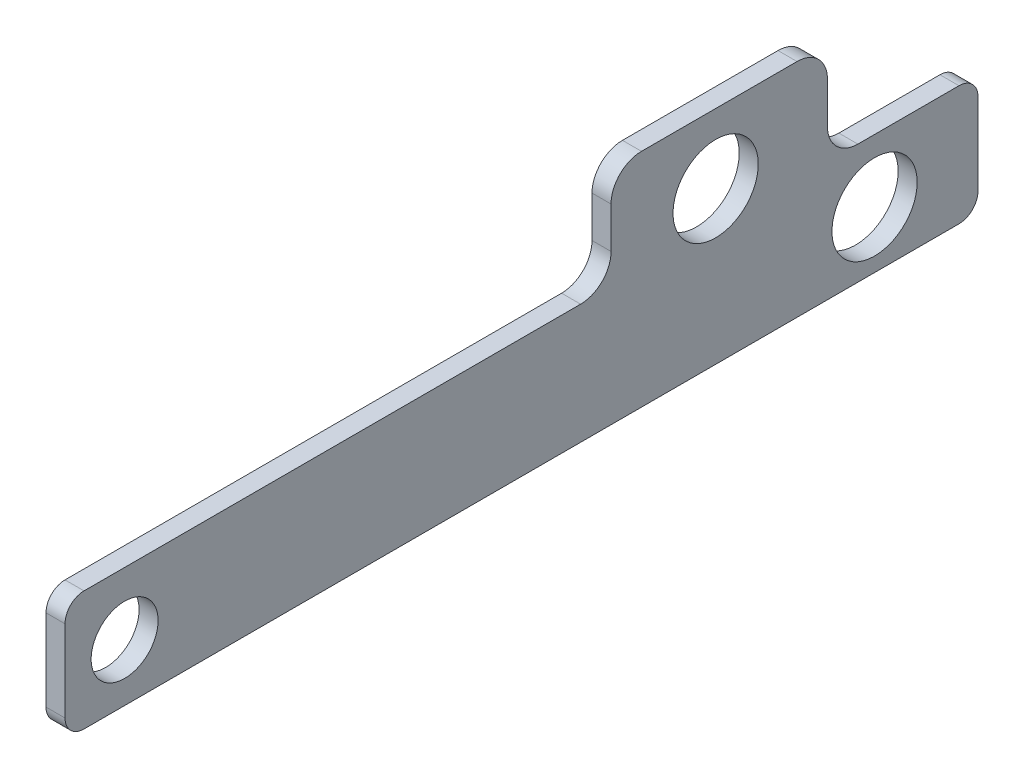
ISO-10303-21;
HEADER;
FILE_DESCRIPTION(('STEP AP214'),'2;1');
FILE_NAME('part.step','',(''),(''),'','','');
FILE_SCHEMA(('AUTOMOTIVE_DESIGN { 1 0 10303 214 1 1 1 1 }'));
ENDSEC;
DATA;
#1=APPLICATION_CONTEXT('core data for automotive mechanical design processes');
#2=APPLICATION_PROTOCOL_DEFINITION('international standard','automotive_design',2000,#1);
#3=PRODUCT_CONTEXT('',#1,'mechanical');
#4=PRODUCT('Part','Part','',(#3));
#5=PRODUCT_RELATED_PRODUCT_CATEGORY('part','',(#4));
#6=PRODUCT_DEFINITION_FORMATION('','',#4);
#7=PRODUCT_DEFINITION_CONTEXT('part definition',#1,'design');
#8=PRODUCT_DEFINITION('design','',#6,#7);
#9=PRODUCT_DEFINITION_SHAPE('','',#8);
#10=(LENGTH_UNIT() NAMED_UNIT(*) SI_UNIT(.MILLI.,.METRE.));
#11=(NAMED_UNIT(*) PLANE_ANGLE_UNIT() SI_UNIT($,.RADIAN.));
#12=(NAMED_UNIT(*) SI_UNIT($,.STERADIAN.) SOLID_ANGLE_UNIT());
#13=UNCERTAINTY_MEASURE_WITH_UNIT(LENGTH_MEASURE(1.E-05),#10,'distance_accuracy_value','');
#14=(GEOMETRIC_REPRESENTATION_CONTEXT(3) GLOBAL_UNCERTAINTY_ASSIGNED_CONTEXT((#13)) GLOBAL_UNIT_ASSIGNED_CONTEXT((#10,
#11,#12)) REPRESENTATION_CONTEXT('',''));
#15=CARTESIAN_POINT('',(0.,0.,0.));
#16=DIRECTION('',(0.,0.,1.));
#17=DIRECTION('',(1.,0.,0.));
#18=AXIS2_PLACEMENT_3D('',#15,#16,#17);
#19=CARTESIAN_POINT('',(6.35,23.1734812702163,0.));
#20=DIRECTION('',(0.,1.,0.));
#21=DIRECTION('',(0.,0.,1.));
#22=AXIS2_PLACEMENT_3D('',#19,#20,#21);
#23=PLANE('',#22);
#24=DIRECTION('',(0.,0.,-1.));
#25=VECTOR('',#24,1.);
#26=CARTESIAN_POINT('',(0.,23.1734812702163,0.));
#27=LINE('',#26,#25);
#28=CARTESIAN_POINT('',(0.,23.1734812702163,-192.451413184352));
#29=VERTEX_POINT('',#28);
#30=CARTESIAN_POINT('',(0.,23.1734812702163,-244.379560249725));
#31=VERTEX_POINT('',#30);
#32=EDGE_CURVE('E317',#29,#31,#27,.T.);
#33=ORIENTED_EDGE('',*,*,#32,.F.);
#34=DIRECTION('',(-1.,0.,0.));
#35=VECTOR('',#34,1.);
#36=CARTESIAN_POINT('',(6.35,23.1734812702163,-192.451413184352));
#37=LINE('',#36,#35);
#38=CARTESIAN_POINT('',(6.35,23.1734812702163,-192.451413184352));
#39=VERTEX_POINT('',#38);
#40=EDGE_CURVE('E256',#29,#39,#37,.F.);
#41=ORIENTED_EDGE('',*,*,#40,.T.);
#42=DIRECTION('',(0.,0.,-1.));
#43=VECTOR('',#42,1.);
#44=CARTESIAN_POINT('',(6.35,23.1734812702163,0.));
#45=LINE('',#44,#43);
#46=CARTESIAN_POINT('',(6.35,23.1734812702163,-244.379560249725));
#47=VERTEX_POINT('',#46);
#48=EDGE_CURVE('E347',#39,#47,#45,.T.);
#49=ORIENTED_EDGE('',*,*,#48,.T.);
#50=DIRECTION('',(-1.,0.,0.));
#51=VECTOR('',#50,1.);
#52=CARTESIAN_POINT('',(0.,23.1734812702163,-244.379560249725));
#53=LINE('',#52,#51);
#54=EDGE_CURVE('E252',#47,#31,#53,.T.);
#55=ORIENTED_EDGE('',*,*,#54,.T.);
#56=EDGE_LOOP('',(#33,#41,#49,#55));
#57=FACE_BOUND('',#56,.T.);
#58=ADVANCED_FACE('F41',(#57),#23,.T.);
#59=CARTESIAN_POINT('',(6.35,0.,-182.291413184352));
#60=DIRECTION('',(0.,0.,1.));
#61=DIRECTION('',(1.,0.,0.));
#62=AXIS2_PLACEMENT_3D('',#59,#60,#61);
#63=PLANE('',#62);
#64=DIRECTION('',(0.,1.,0.));
#65=VECTOR('',#64,1.);
#66=CARTESIAN_POINT('',(6.35,0.,-182.291413184352));
#67=LINE('',#66,#65);
#68=CARTESIAN_POINT('',(6.35,-0.698938763049273,-182.291413184352));
#69=VERTEX_POINT('',#68);
#70=CARTESIAN_POINT('',(6.35,13.0134812702163,-182.291413184352));
#71=VERTEX_POINT('',#70);
#72=EDGE_CURVE('E353',#69,#71,#67,.T.);
#73=ORIENTED_EDGE('',*,*,#72,.T.);
#74=DIRECTION('',(-1.,0.,0.));
#75=VECTOR('',#74,1.);
#76=CARTESIAN_POINT('',(6.35,13.0134812702163,-182.291413184352));
#77=LINE('',#76,#75);
#78=CARTESIAN_POINT('',(0.,13.0134812702163,-182.291413184352));
#79=VERTEX_POINT('',#78);
#80=EDGE_CURVE('E242',#71,#79,#77,.T.);
#81=ORIENTED_EDGE('',*,*,#80,.T.);
#82=DIRECTION('',(0.,1.,0.));
#83=VECTOR('',#82,1.);
#84=CARTESIAN_POINT('',(0.,0.,-182.291413184352));
#85=LINE('',#84,#83);
#86=CARTESIAN_POINT('',(0.,-0.698938763049273,-182.291413184352));
#87=VERTEX_POINT('',#86);
#88=EDGE_CURVE('E321',#87,#79,#85,.T.);
#89=ORIENTED_EDGE('',*,*,#88,.F.);
#90=DIRECTION('',(-1.,0.,0.));
#91=VECTOR('',#90,1.);
#92=CARTESIAN_POINT('',(6.35,-0.698938763049273,-182.291413184352));
#93=LINE('',#92,#91);
#94=EDGE_CURVE('E239',#87,#69,#93,.F.);
#95=ORIENTED_EDGE('',*,*,#94,.T.);
#96=EDGE_LOOP('',(#73,#81,#89,#95));
#97=FACE_BOUND('',#96,.T.);
#98=ADVANCED_FACE('F401',(#97),#63,.T.);
#99=CARTESIAN_POINT('',(6.35,-10.8589387630493,0.));
#100=DIRECTION('',(0.,1.,0.));
#101=DIRECTION('',(0.,0.,1.));
#102=AXIS2_PLACEMENT_3D('',#99,#100,#101);
#103=PLANE('',#102);
#104=DIRECTION('',(0.,0.,-1.));
#105=VECTOR('',#104,1.);
#106=CARTESIAN_POINT('',(6.35,-10.8589387630493,0.));
#107=LINE('',#106,#105);
#108=CARTESIAN_POINT('',(6.35,-10.8589387630493,-6.35));
#109=VERTEX_POINT('',#108);
#110=CARTESIAN_POINT('',(6.35,-10.8589387630493,-172.131413184352));
#111=VERTEX_POINT('',#110);
#112=EDGE_CURVE('E359',#109,#111,#107,.T.);
#113=ORIENTED_EDGE('',*,*,#112,.T.);
#114=DIRECTION('',(-1.,0.,0.));
#115=VECTOR('',#114,1.);
#116=CARTESIAN_POINT('',(0.,-10.8589387630493,-172.131413184352));
#117=LINE('',#116,#115);
#118=CARTESIAN_POINT('',(0.,-10.8589387630493,-172.131413184352));
#119=VERTEX_POINT('',#118);
#120=EDGE_CURVE('E265',#111,#119,#117,.T.);
#121=ORIENTED_EDGE('',*,*,#120,.T.);
#122=DIRECTION('',(0.,0.,-1.));
#123=VECTOR('',#122,1.);
#124=CARTESIAN_POINT('',(0.,-10.8589387630493,0.));
#125=LINE('',#124,#123);
#126=CARTESIAN_POINT('',(0.,-10.8589387630493,-6.35));
#127=VERTEX_POINT('',#126);
#128=EDGE_CURVE('E324',#127,#119,#125,.T.);
#129=ORIENTED_EDGE('',*,*,#128,.F.);
#130=DIRECTION('',(-1.,0.,0.));
#131=VECTOR('',#130,1.);
#132=CARTESIAN_POINT('',(6.35,-10.8589387630493,-6.35));
#133=LINE('',#132,#131);
#134=EDGE_CURVE('E236',#127,#109,#133,.F.);
#135=ORIENTED_EDGE('',*,*,#134,.T.);
#136=EDGE_LOOP('',(#113,#121,#129,#135));
#137=FACE_BOUND('',#136,.T.);
#138=ADVANCED_FACE('F394',(#137),#103,.T.);
#139=CARTESIAN_POINT('',(6.35,0.,0.));
#140=DIRECTION('',(0.,0.,-1.));
#141=DIRECTION('',(0.,1.,0.));
#142=AXIS2_PLACEMENT_3D('',#139,#140,#141);
#143=PLANE('',#142);
#144=DIRECTION('',(0.,-1.,0.));
#145=VECTOR('',#144,1.);
#146=CARTESIAN_POINT('',(0.,0.,0.));
#147=LINE('',#146,#145);
#148=CARTESIAN_POINT('',(0.,-17.2089387630493,0.));
#149=VERTEX_POINT('',#148);
#150=CARTESIAN_POINT('',(0.,-44.45,0.));
#151=VERTEX_POINT('',#150);
#152=EDGE_CURVE('E328',#149,#151,#147,.T.);
#153=ORIENTED_EDGE('',*,*,#152,.T.);
#154=DIRECTION('',(-1.,0.,0.));
#155=VECTOR('',#154,1.);
#156=CARTESIAN_POINT('',(6.35,-44.45,0.));
#157=LINE('',#156,#155);
#158=CARTESIAN_POINT('',(6.35,-44.45,0.));
#159=VERTEX_POINT('',#158);
#160=EDGE_CURVE('E233',#151,#159,#157,.F.);
#161=ORIENTED_EDGE('',*,*,#160,.T.);
#162=DIRECTION('',(0.,-1.,0.));
#163=VECTOR('',#162,1.);
#164=CARTESIAN_POINT('',(6.35,0.,0.));
#165=LINE('',#164,#163);
#166=CARTESIAN_POINT('',(6.35,-17.2089387630493,0.));
#167=VERTEX_POINT('',#166);
#168=EDGE_CURVE('E362',#167,#159,#165,.T.);
#169=ORIENTED_EDGE('',*,*,#168,.F.);
#170=DIRECTION('',(-1.,0.,0.));
#171=VECTOR('',#170,1.);
#172=CARTESIAN_POINT('',(0.,-17.2089387630493,0.));
#173=LINE('',#172,#171);
#174=EDGE_CURVE('E229',#167,#149,#173,.T.);
#175=ORIENTED_EDGE('',*,*,#174,.T.);
#176=EDGE_LOOP('',(#153,#161,#169,#175));
#177=FACE_BOUND('',#176,.T.);
#178=ADVANCED_FACE('F385',(#177),#143,.F.);
#179=CARTESIAN_POINT('',(6.35,-50.8,0.));
#180=DIRECTION('',(0.,1.,0.));
#181=DIRECTION('',(0.,0.,1.));
#182=AXIS2_PLACEMENT_3D('',#179,#180,#181);
#183=PLANE('',#182);
#184=DIRECTION('',(0.,0.,-1.));
#185=VECTOR('',#184,1.);
#186=CARTESIAN_POINT('',(0.,-50.8,0.));
#187=LINE('',#186,#185);
#188=CARTESIAN_POINT('',(0.,-50.8,-6.35));
#189=VERTEX_POINT('',#188);
#190=CARTESIAN_POINT('',(0.,-50.8,-298.45));
#191=VERTEX_POINT('',#190);
#192=EDGE_CURVE('E183',#189,#191,#187,.T.);
#193=ORIENTED_EDGE('',*,*,#192,.T.);
#194=DIRECTION('',(-1.,0.,0.));
#195=VECTOR('',#194,1.);
#196=CARTESIAN_POINT('',(6.35,-50.8,-298.45));
#197=LINE('',#196,#195);
#198=CARTESIAN_POINT('',(6.35,-50.8,-298.45));
#199=VERTEX_POINT('',#198);
#200=EDGE_CURVE('E212',#191,#199,#197,.F.);
#201=ORIENTED_EDGE('',*,*,#200,.T.);
#202=DIRECTION('',(0.,0.,-1.));
#203=VECTOR('',#202,1.);
#204=CARTESIAN_POINT('',(6.35,-50.8,0.));
#205=LINE('',#204,#203);
#206=CARTESIAN_POINT('',(6.35,-50.8,-6.35));
#207=VERTEX_POINT('',#206);
#208=EDGE_CURVE('E366',#207,#199,#205,.T.);
#209=ORIENTED_EDGE('',*,*,#208,.F.);
#210=DIRECTION('',(-1.,0.,0.));
#211=VECTOR('',#210,1.);
#212=CARTESIAN_POINT('',(6.35,-50.8,-6.35));
#213=LINE('',#212,#211);
#214=EDGE_CURVE('E208',#207,#189,#213,.T.);
#215=ORIENTED_EDGE('',*,*,#214,.T.);
#216=EDGE_LOOP('',(#193,#201,#209,#215));
#217=FACE_BOUND('',#216,.T.);
#218=ADVANCED_FACE('F376',(#217),#183,.F.);
#219=CARTESIAN_POINT('',(6.35,0.,-304.8));
#220=DIRECTION('',(0.,0.,-1.));
#221=DIRECTION('',(-1.,0.,0.));
#222=AXIS2_PLACEMENT_3D('',#219,#220,#221);
#223=PLANE('',#222);
#224=DIRECTION('',(0.,-1.,0.));
#225=VECTOR('',#224,1.);
#226=CARTESIAN_POINT('',(6.35,0.,-304.8));
#227=LINE('',#226,#225);
#228=CARTESIAN_POINT('',(6.35,-17.2089387630493,-304.8));
#229=VERTEX_POINT('',#228);
#230=CARTESIAN_POINT('',(6.35,-44.45,-304.8));
#231=VERTEX_POINT('',#230);
#232=EDGE_CURVE('E309',#229,#231,#227,.T.);
#233=ORIENTED_EDGE('',*,*,#232,.T.);
#234=DIRECTION('',(-1.,0.,0.));
#235=VECTOR('',#234,1.);
#236=CARTESIAN_POINT('',(0.,-44.45,-304.8));
#237=LINE('',#236,#235);
#238=CARTESIAN_POINT('',(0.,-44.45,-304.8));
#239=VERTEX_POINT('',#238);
#240=EDGE_CURVE('E181',#231,#239,#237,.T.);
#241=ORIENTED_EDGE('',*,*,#240,.T.);
#242=DIRECTION('',(0.,-1.,0.));
#243=VECTOR('',#242,1.);
#244=CARTESIAN_POINT('',(0.,0.,-304.8));
#245=LINE('',#244,#243);
#246=CARTESIAN_POINT('',(0.,-17.2089387630493,-304.8));
#247=VERTEX_POINT('',#246);
#248=EDGE_CURVE('E163',#247,#239,#245,.T.);
#249=ORIENTED_EDGE('',*,*,#248,.F.);
#250=DIRECTION('',(-1.,0.,0.));
#251=VECTOR('',#250,1.);
#252=CARTESIAN_POINT('',(6.35,-17.2089387630493,-304.8));
#253=LINE('',#252,#251);
#254=EDGE_CURVE('E178',#247,#229,#253,.F.);
#255=ORIENTED_EDGE('',*,*,#254,.T.);
#256=EDGE_LOOP('',(#233,#241,#249,#255));
#257=FACE_BOUND('',#256,.T.);
#258=ADVANCED_FACE('F177',(#257),#223,.T.);
#259=CARTESIAN_POINT('',(6.35,-10.8589387630493,0.));
#260=DIRECTION('',(0.,-1.,0.));
#261=DIRECTION('',(0.,0.,-1.));
#262=AXIS2_PLACEMENT_3D('',#259,#260,#261);
#263=PLANE('',#262);
#264=DIRECTION('',(0.,0.,1.));
#265=VECTOR('',#264,1.);
#266=CARTESIAN_POINT('',(0.,-10.8589387630493,0.));
#267=LINE('',#266,#265);
#268=CARTESIAN_POINT('',(0.,-10.8589387630493,-298.45));
#269=VERTEX_POINT('',#268);
#270=CARTESIAN_POINT('',(0.,-10.8589387630493,-264.699560249725));
#271=VERTEX_POINT('',#270);
#272=EDGE_CURVE('E165',#269,#271,#267,.T.);
#273=ORIENTED_EDGE('',*,*,#272,.T.);
#274=DIRECTION('',(-1.,0.,0.));
#275=VECTOR('',#274,1.);
#276=CARTESIAN_POINT('',(6.35,-10.8589387630493,-264.699560249725));
#277=LINE('',#276,#275);
#278=CARTESIAN_POINT('',(6.35,-10.8589387630493,-264.699560249725));
#279=VERTEX_POINT('',#278);
#280=EDGE_CURVE('E275',#271,#279,#277,.F.);
#281=ORIENTED_EDGE('',*,*,#280,.T.);
#282=DIRECTION('',(0.,0.,1.));
#283=VECTOR('',#282,1.);
#284=CARTESIAN_POINT('',(6.35,-10.8589387630493,0.));
#285=LINE('',#284,#283);
#286=CARTESIAN_POINT('',(6.35,-10.8589387630493,-298.45));
#287=VERTEX_POINT('',#286);
#288=EDGE_CURVE('E301',#287,#279,#285,.T.);
#289=ORIENTED_EDGE('',*,*,#288,.F.);
#290=DIRECTION('',(-1.,0.,0.));
#291=VECTOR('',#290,1.);
#292=CARTESIAN_POINT('',(0.,-10.8589387630493,-298.45));
#293=LINE('',#292,#291);
#294=EDGE_CURVE('E226',#287,#269,#293,.T.);
#295=ORIENTED_EDGE('',*,*,#294,.T.);
#296=EDGE_LOOP('',(#273,#281,#289,#295));
#297=FACE_BOUND('',#296,.T.);
#298=ADVANCED_FACE('F289',(#297),#263,.F.);
#299=CARTESIAN_POINT('',(6.35,-31.79237268089,-270.266345373855));
#300=DIRECTION('',(-1.,0.,0.));
#301=DIRECTION('',(0.,0.,1.));
#302=AXIS2_PLACEMENT_3D('',#299,#300,#301);
#303=CYLINDRICAL_SURFACE('',#302,14.224);
#304=CARTESIAN_POINT('',(6.35,-31.79237268089,-270.266345373855));
#305=DIRECTION('',(1.,0.,0.));
#306=DIRECTION('',(0.,0.,-1.));
#307=AXIS2_PLACEMENT_3D('',#304,#305,#306);
#308=CIRCLE('',#307,14.224);
#309=CARTESIAN_POINT('',(6.35,-31.79237268089,-284.490345373855));
#310=VERTEX_POINT('',#309);
#311=EDGE_CURVE('E196',#310,#310,#308,.T.);
#312=ORIENTED_EDGE('',*,*,#311,.T.);
#313=EDGE_LOOP('',(#312));
#314=FACE_BOUND('',#313,.T.);
#315=CARTESIAN_POINT('',(0.,-31.79237268089,-270.266345373855));
#316=DIRECTION('',(1.,0.,0.));
#317=DIRECTION('',(0.,0.,-1.));
#318=AXIS2_PLACEMENT_3D('',#315,#316,#317);
#319=CIRCLE('',#318,14.224);
#320=CARTESIAN_POINT('',(0.,-31.79237268089,-284.490345373855));
#321=VERTEX_POINT('',#320);
#322=EDGE_CURVE('E336',#321,#321,#319,.T.);
#323=ORIENTED_EDGE('',*,*,#322,.F.);
#324=EDGE_LOOP('',(#323));
#325=FACE_BOUND('',#324,.T.);
#326=ADVANCED_FACE('F509',(#314,#325),#303,.F.);
#327=CARTESIAN_POINT('',(6.35,0.,-254.539560249725));
#328=DIRECTION('',(0.,0.,1.));
#329=DIRECTION('',(1.,0.,0.));
#330=AXIS2_PLACEMENT_3D('',#327,#328,#329);
#331=PLANE('',#330);
#332=DIRECTION('',(0.,1.,0.));
#333=VECTOR('',#332,1.);
#334=CARTESIAN_POINT('',(6.35,0.,-254.539560249725));
#335=LINE('',#334,#333);
#336=CARTESIAN_POINT('',(6.35,-0.698938763049273,-254.539560249725));
#337=VERTEX_POINT('',#336);
#338=CARTESIAN_POINT('',(6.35,13.0134812702163,-254.539560249725));
#339=VERTEX_POINT('',#338);
#340=EDGE_CURVE('E299',#337,#339,#335,.T.);
#341=ORIENTED_EDGE('',*,*,#340,.F.);
#342=DIRECTION('',(-1.,0.,0.));
#343=VECTOR('',#342,1.);
#344=CARTESIAN_POINT('',(0.,-0.698938763049273,-254.539560249725));
#345=LINE('',#344,#343);
#346=CARTESIAN_POINT('',(0.,-0.698938763049273,-254.539560249725));
#347=VERTEX_POINT('',#346);
#348=EDGE_CURVE('E271',#337,#347,#345,.T.);
#349=ORIENTED_EDGE('',*,*,#348,.T.);
#350=DIRECTION('',(0.,1.,0.));
#351=VECTOR('',#350,1.);
#352=CARTESIAN_POINT('',(0.,0.,-254.539560249725));
#353=LINE('',#352,#351);
#354=CARTESIAN_POINT('',(0.,13.0134812702163,-254.539560249725));
#355=VERTEX_POINT('',#354);
#356=EDGE_CURVE('E284',#347,#355,#353,.T.);
#357=ORIENTED_EDGE('',*,*,#356,.T.);
#358=DIRECTION('',(-1.,0.,0.));
#359=VECTOR('',#358,1.);
#360=CARTESIAN_POINT('',(6.35,13.0134812702163,-254.539560249725));
#361=LINE('',#360,#359);
#362=EDGE_CURVE('E65',#355,#339,#361,.F.);
#363=ORIENTED_EDGE('',*,*,#362,.T.);
#364=EDGE_LOOP('',(#341,#349,#357,#363));
#365=FACE_BOUND('',#364,.T.);
#366=ADVANCED_FACE('F302',(#365),#331,.F.);
#367=CARTESIAN_POINT('',(6.35,0.,-217.210700397704));
#368=DIRECTION('',(-1.,0.,0.));
#369=DIRECTION('',(0.,0.,1.));
#370=AXIS2_PLACEMENT_3D('',#367,#368,#369);
#371=CYLINDRICAL_SURFACE('',#370,14.224);
#372=CARTESIAN_POINT('',(6.35,0.,-217.210700397704));
#373=DIRECTION('',(1.,0.,0.));
#374=DIRECTION('',(0.,0.,-1.));
#375=AXIS2_PLACEMENT_3D('',#372,#373,#374);
#376=CIRCLE('',#375,14.224);
#377=CARTESIAN_POINT('',(6.35,0.,-231.434700397704));
#378=VERTEX_POINT('',#377);
#379=EDGE_CURVE('E342',#378,#378,#376,.T.);
#380=ORIENTED_EDGE('',*,*,#379,.T.);
#381=EDGE_LOOP('',(#380));
#382=FACE_BOUND('',#381,.T.);
#383=CARTESIAN_POINT('',(0.,0.,-217.210700397704));
#384=DIRECTION('',(1.,0.,0.));
#385=DIRECTION('',(0.,0.,-1.));
#386=AXIS2_PLACEMENT_3D('',#383,#384,#385);
#387=CIRCLE('',#386,14.224);
#388=CARTESIAN_POINT('',(0.,0.,-231.434700397704));
#389=VERTEX_POINT('',#388);
#390=EDGE_CURVE('E313',#389,#389,#387,.T.);
#391=ORIENTED_EDGE('',*,*,#390,.F.);
#392=EDGE_LOOP('',(#391));
#393=FACE_BOUND('',#392,.T.);
#394=ADVANCED_FACE('F423',(#382,#393),#371,.F.);
#395=CARTESIAN_POINT('',(6.35,-31.79237268089,-19.8958454166487));
#396=DIRECTION('',(-1.,0.,0.));
#397=DIRECTION('',(0.,0.,1.));
#398=AXIS2_PLACEMENT_3D('',#395,#396,#397);
#399=CYLINDRICAL_SURFACE('',#398,11.176);
#400=CARTESIAN_POINT('',(6.35,-31.79237268089,-19.8958454166487));
#401=DIRECTION('',(1.,0.,0.));
#402=DIRECTION('',(0.,0.,-1.));
#403=AXIS2_PLACEMENT_3D('',#400,#401,#402);
#404=CIRCLE('',#403,11.176);
#405=CARTESIAN_POINT('',(6.35,-31.79237268089,-31.0718454166487));
#406=VERTEX_POINT('',#405);
#407=EDGE_CURVE('E189',#406,#406,#404,.T.);
#408=ORIENTED_EDGE('',*,*,#407,.T.);
#409=EDGE_LOOP('',(#408));
#410=FACE_BOUND('',#409,.T.);
#411=CARTESIAN_POINT('',(0.,-31.79237268089,-19.8958454166487));
#412=DIRECTION('',(1.,0.,0.));
#413=DIRECTION('',(0.,0.,-1.));
#414=AXIS2_PLACEMENT_3D('',#411,#412,#413);
#415=CIRCLE('',#414,11.176);
#416=CARTESIAN_POINT('',(0.,-31.79237268089,-31.0718454166487));
#417=VERTEX_POINT('',#416);
#418=EDGE_CURVE('E199',#417,#417,#415,.T.);
#419=ORIENTED_EDGE('',*,*,#418,.F.);
#420=EDGE_LOOP('',(#419));
#421=FACE_BOUND('',#420,.T.);
#422=ADVANCED_FACE('F426',(#410,#421),#399,.F.);
#423=CARTESIAN_POINT('',(6.35,0.,0.));
#424=DIRECTION('',(1.,0.,0.));
#425=DIRECTION('',(0.,0.,-1.));
#426=AXIS2_PLACEMENT_3D('',#423,#424,#425);
#427=PLANE('',#426);
#428=ORIENTED_EDGE('',*,*,#379,.F.);
#429=EDGE_LOOP('',(#428));
#430=FACE_BOUND('',#429,.T.);
#431=ORIENTED_EDGE('',*,*,#48,.F.);
#432=CARTESIAN_POINT('',(6.35,13.0134812702163,-192.451413184352));
#433=DIRECTION('',(1.,0.,0.));
#434=DIRECTION('',(0.,0.,-1.));
#435=AXIS2_PLACEMENT_3D('',#432,#433,#434);
#436=CIRCLE('',#435,10.16);
#437=EDGE_CURVE('E262',#39,#71,#436,.T.);
#438=ORIENTED_EDGE('',*,*,#437,.T.);
#439=ORIENTED_EDGE('',*,*,#72,.F.);
#440=CARTESIAN_POINT('',(6.35,-0.698938763049273,-172.131413184352));
#441=DIRECTION('',(1.,0.,0.));
#442=DIRECTION('',(0.,0.,-1.));
#443=AXIS2_PLACEMENT_3D('',#440,#441,#442);
#444=CIRCLE('',#443,10.16);
#445=EDGE_CURVE('E57',#69,#111,#444,.F.);
#446=ORIENTED_EDGE('',*,*,#445,.T.);
#447=ORIENTED_EDGE('',*,*,#112,.F.);
#448=CARTESIAN_POINT('',(6.35,-17.2089387630493,-6.35));
#449=DIRECTION('',(1.,0.,0.));
#450=DIRECTION('',(0.,0.,-1.));
#451=AXIS2_PLACEMENT_3D('',#448,#449,#450);
#452=CIRCLE('',#451,6.35);
#453=EDGE_CURVE('E215',#109,#167,#452,.T.);
#454=ORIENTED_EDGE('',*,*,#453,.T.);
#455=ORIENTED_EDGE('',*,*,#168,.T.);
#456=CARTESIAN_POINT('',(6.35,-44.45,-6.35));
#457=DIRECTION('',(1.,0.,0.));
#458=DIRECTION('',(0.,0.,-1.));
#459=AXIS2_PLACEMENT_3D('',#456,#457,#458);
#460=CIRCLE('',#459,6.35);
#461=EDGE_CURVE('E218',#159,#207,#460,.T.);
#462=ORIENTED_EDGE('',*,*,#461,.T.);
#463=ORIENTED_EDGE('',*,*,#208,.T.);
#464=CARTESIAN_POINT('',(6.35,-44.45,-298.45));
#465=DIRECTION('',(1.,0.,0.));
#466=DIRECTION('',(0.,0.,-1.));
#467=AXIS2_PLACEMENT_3D('',#464,#465,#466);
#468=CIRCLE('',#467,6.35);
#469=EDGE_CURVE('E223',#199,#231,#468,.T.);
#470=ORIENTED_EDGE('',*,*,#469,.T.);
#471=ORIENTED_EDGE('',*,*,#232,.F.);
#472=CARTESIAN_POINT('',(6.35,-17.2089387630493,-298.45));
#473=DIRECTION('',(1.,0.,0.));
#474=DIRECTION('',(0.,0.,-1.));
#475=AXIS2_PLACEMENT_3D('',#472,#473,#474);
#476=CIRCLE('',#475,6.35);
#477=EDGE_CURVE('E187',#229,#287,#476,.T.);
#478=ORIENTED_EDGE('',*,*,#477,.T.);
#479=ORIENTED_EDGE('',*,*,#288,.T.);
#480=CARTESIAN_POINT('',(6.35,-0.698938763049273,-264.699560249725));
#481=DIRECTION('',(1.,0.,0.));
#482=DIRECTION('',(0.,0.,-1.));
#483=AXIS2_PLACEMENT_3D('',#480,#481,#482);
#484=CIRCLE('',#483,10.16);
#485=EDGE_CURVE('E11',#279,#337,#484,.F.);
#486=ORIENTED_EDGE('',*,*,#485,.T.);
#487=ORIENTED_EDGE('',*,*,#340,.T.);
#488=CARTESIAN_POINT('',(6.35,13.0134812702163,-244.379560249725));
#489=DIRECTION('',(1.,0.,0.));
#490=DIRECTION('',(0.,0.,-1.));
#491=AXIS2_PLACEMENT_3D('',#488,#489,#490);
#492=CIRCLE('',#491,10.16);
#493=EDGE_CURVE('E259',#339,#47,#492,.T.);
#494=ORIENTED_EDGE('',*,*,#493,.T.);
#495=EDGE_LOOP('',(#431,#438,#439,#446,#447,#454,#455,#462,#463,#470,#471,#478,#479,#486,#487,#494));
#496=FACE_BOUND('',#495,.T.);
#497=ORIENTED_EDGE('',*,*,#311,.F.);
#498=EDGE_LOOP('',(#497));
#499=FACE_BOUND('',#498,.T.);
#500=ORIENTED_EDGE('',*,*,#407,.F.);
#501=EDGE_LOOP('',(#500));
#502=FACE_BOUND('',#501,.T.);
#503=ADVANCED_FACE('F297',(#430,#496,#499,#502),#427,.T.);
#504=CARTESIAN_POINT('',(0.,0.,0.));
#505=DIRECTION('',(1.,0.,0.));
#506=DIRECTION('',(0.,0.,-1.));
#507=AXIS2_PLACEMENT_3D('',#504,#505,#506);
#508=PLANE('',#507);
#509=ORIENTED_EDGE('',*,*,#390,.T.);
#510=EDGE_LOOP('',(#509));
#511=FACE_BOUND('',#510,.T.);
#512=ORIENTED_EDGE('',*,*,#88,.T.);
#513=CARTESIAN_POINT('',(0.,13.0134812702163,-192.451413184352));
#514=DIRECTION('',(1.,0.,0.));
#515=DIRECTION('',(0.,0.,-1.));
#516=AXIS2_PLACEMENT_3D('',#513,#514,#515);
#517=CIRCLE('',#516,10.16);
#518=EDGE_CURVE('E249',#79,#29,#517,.F.);
#519=ORIENTED_EDGE('',*,*,#518,.T.);
#520=ORIENTED_EDGE('',*,*,#32,.T.);
#521=CARTESIAN_POINT('',(0.,13.0134812702163,-244.379560249725));
#522=DIRECTION('',(1.,0.,0.));
#523=DIRECTION('',(0.,0.,-1.));
#524=AXIS2_PLACEMENT_3D('',#521,#522,#523);
#525=CIRCLE('',#524,10.16);
#526=EDGE_CURVE('E246',#31,#355,#525,.F.);
#527=ORIENTED_EDGE('',*,*,#526,.T.);
#528=ORIENTED_EDGE('',*,*,#356,.F.);
#529=CARTESIAN_POINT('',(0.,-0.698938763049273,-264.699560249725));
#530=DIRECTION('',(1.,0.,0.));
#531=DIRECTION('',(0.,0.,-1.));
#532=AXIS2_PLACEMENT_3D('',#529,#530,#531);
#533=CIRCLE('',#532,10.16);
#534=EDGE_CURVE('E50',#347,#271,#533,.T.);
#535=ORIENTED_EDGE('',*,*,#534,.T.);
#536=ORIENTED_EDGE('',*,*,#272,.F.);
#537=CARTESIAN_POINT('',(0.,-17.2089387630493,-298.45));
#538=DIRECTION('',(1.,0.,0.));
#539=DIRECTION('',(0.,0.,-1.));
#540=AXIS2_PLACEMENT_3D('',#537,#538,#539);
#541=CIRCLE('',#540,6.35);
#542=EDGE_CURVE('E158',#269,#247,#541,.F.);
#543=ORIENTED_EDGE('',*,*,#542,.T.);
#544=ORIENTED_EDGE('',*,*,#248,.T.);
#545=CARTESIAN_POINT('',(0.,-44.45,-298.45));
#546=DIRECTION('',(1.,0.,0.));
#547=DIRECTION('',(0.,0.,-1.));
#548=AXIS2_PLACEMENT_3D('',#545,#546,#547);
#549=CIRCLE('',#548,6.35);
#550=EDGE_CURVE('E171',#239,#191,#549,.F.);
#551=ORIENTED_EDGE('',*,*,#550,.T.);
#552=ORIENTED_EDGE('',*,*,#192,.F.);
#553=CARTESIAN_POINT('',(0.,-44.45,-6.35));
#554=DIRECTION('',(1.,0.,0.));
#555=DIRECTION('',(0.,0.,-1.));
#556=AXIS2_PLACEMENT_3D('',#553,#554,#555);
#557=CIRCLE('',#556,6.35);
#558=EDGE_CURVE('E172',#189,#151,#557,.F.);
#559=ORIENTED_EDGE('',*,*,#558,.T.);
#560=ORIENTED_EDGE('',*,*,#152,.F.);
#561=CARTESIAN_POINT('',(0.,-17.2089387630493,-6.35));
#562=DIRECTION('',(1.,0.,0.));
#563=DIRECTION('',(0.,0.,-1.));
#564=AXIS2_PLACEMENT_3D('',#561,#562,#563);
#565=CIRCLE('',#564,6.35);
#566=EDGE_CURVE('E193',#149,#127,#565,.F.);
#567=ORIENTED_EDGE('',*,*,#566,.T.);
#568=ORIENTED_EDGE('',*,*,#128,.T.);
#569=CARTESIAN_POINT('',(0.,-0.698938763049273,-172.131413184352));
#570=DIRECTION('',(1.,0.,0.));
#571=DIRECTION('',(0.,0.,-1.));
#572=AXIS2_PLACEMENT_3D('',#569,#570,#571);
#573=CIRCLE('',#572,10.16);
#574=EDGE_CURVE('E278',#119,#87,#573,.T.);
#575=ORIENTED_EDGE('',*,*,#574,.T.);
#576=EDGE_LOOP('',(#512,#519,#520,#527,#528,#535,#536,#543,#544,#551,#552,#559,#560,#567,#568,#575));
#577=FACE_BOUND('',#576,.T.);
#578=ORIENTED_EDGE('',*,*,#322,.T.);
#579=EDGE_LOOP('',(#578));
#580=FACE_BOUND('',#579,.T.);
#581=ORIENTED_EDGE('',*,*,#418,.T.);
#582=EDGE_LOOP('',(#581));
#583=FACE_BOUND('',#582,.T.);
#584=ADVANCED_FACE('F161',(#511,#577,#580,#583),#508,.F.);
#585=CARTESIAN_POINT('',(6.35,-44.45,-298.45));
#586=DIRECTION('',(1.,0.,0.));
#587=DIRECTION('',(0.,0.,-1.));
#588=AXIS2_PLACEMENT_3D('',#585,#586,#587);
#589=CYLINDRICAL_SURFACE('',#588,6.35);
#590=ORIENTED_EDGE('',*,*,#469,.F.);
#591=ORIENTED_EDGE('',*,*,#200,.F.);
#592=ORIENTED_EDGE('',*,*,#550,.F.);
#593=ORIENTED_EDGE('',*,*,#240,.F.);
#594=EDGE_LOOP('',(#590,#591,#592,#593));
#595=FACE_BOUND('',#594,.T.);
#596=ADVANCED_FACE('F372',(#595),#589,.T.);
#597=CARTESIAN_POINT('',(6.35,-17.2089387630493,-298.45));
#598=DIRECTION('',(1.,0.,0.));
#599=DIRECTION('',(0.,0.,-1.));
#600=AXIS2_PLACEMENT_3D('',#597,#598,#599);
#601=CYLINDRICAL_SURFACE('',#600,6.35);
#602=ORIENTED_EDGE('',*,*,#477,.F.);
#603=ORIENTED_EDGE('',*,*,#254,.F.);
#604=ORIENTED_EDGE('',*,*,#542,.F.);
#605=ORIENTED_EDGE('',*,*,#294,.F.);
#606=EDGE_LOOP('',(#602,#603,#604,#605));
#607=FACE_BOUND('',#606,.T.);
#608=ADVANCED_FACE('F186',(#607),#601,.T.);
#609=CARTESIAN_POINT('',(6.35,-44.45,-6.35));
#610=DIRECTION('',(-1.,0.,0.));
#611=DIRECTION('',(0.,0.,1.));
#612=AXIS2_PLACEMENT_3D('',#609,#610,#611);
#613=CYLINDRICAL_SURFACE('',#612,6.35);
#614=ORIENTED_EDGE('',*,*,#461,.F.);
#615=ORIENTED_EDGE('',*,*,#160,.F.);
#616=ORIENTED_EDGE('',*,*,#558,.F.);
#617=ORIENTED_EDGE('',*,*,#214,.F.);
#618=EDGE_LOOP('',(#614,#615,#616,#617));
#619=FACE_BOUND('',#618,.T.);
#620=ADVANCED_FACE('F381',(#619),#613,.T.);
#621=CARTESIAN_POINT('',(6.35,-17.2089387630493,-6.35));
#622=DIRECTION('',(1.,0.,0.));
#623=DIRECTION('',(0.,0.,-1.));
#624=AXIS2_PLACEMENT_3D('',#621,#622,#623);
#625=CYLINDRICAL_SURFACE('',#624,6.35);
#626=ORIENTED_EDGE('',*,*,#453,.F.);
#627=ORIENTED_EDGE('',*,*,#134,.F.);
#628=ORIENTED_EDGE('',*,*,#566,.F.);
#629=ORIENTED_EDGE('',*,*,#174,.F.);
#630=EDGE_LOOP('',(#626,#627,#628,#629));
#631=FACE_BOUND('',#630,.T.);
#632=ADVANCED_FACE('F390',(#631),#625,.T.);
#633=CARTESIAN_POINT('',(6.35,13.0134812702163,-192.451413184352));
#634=DIRECTION('',(-1.,0.,0.));
#635=DIRECTION('',(0.,0.,1.));
#636=AXIS2_PLACEMENT_3D('',#633,#634,#635);
#637=CYLINDRICAL_SURFACE('',#636,10.16);
#638=ORIENTED_EDGE('',*,*,#437,.F.);
#639=ORIENTED_EDGE('',*,*,#40,.F.);
#640=ORIENTED_EDGE('',*,*,#518,.F.);
#641=ORIENTED_EDGE('',*,*,#80,.F.);
#642=EDGE_LOOP('',(#638,#639,#640,#641));
#643=FACE_BOUND('',#642,.T.);
#644=ADVANCED_FACE('F405',(#643),#637,.T.);
#645=CARTESIAN_POINT('',(6.35,-0.698938763049273,-172.131413184352));
#646=DIRECTION('',(1.,0.,0.));
#647=DIRECTION('',(0.,0.,-1.));
#648=AXIS2_PLACEMENT_3D('',#645,#646,#647);
#649=CYLINDRICAL_SURFACE('',#648,10.16);
#650=ORIENTED_EDGE('',*,*,#445,.F.);
#651=ORIENTED_EDGE('',*,*,#94,.F.);
#652=ORIENTED_EDGE('',*,*,#574,.F.);
#653=ORIENTED_EDGE('',*,*,#120,.F.);
#654=EDGE_LOOP('',(#650,#651,#652,#653));
#655=FACE_BOUND('',#654,.T.);
#656=ADVANCED_FACE('F397',(#655),#649,.F.);
#657=CARTESIAN_POINT('',(6.35,-0.698938763049273,-264.699560249725));
#658=DIRECTION('',(1.,0.,0.));
#659=DIRECTION('',(0.,0.,-1.));
#660=AXIS2_PLACEMENT_3D('',#657,#658,#659);
#661=CYLINDRICAL_SURFACE('',#660,10.16);
#662=ORIENTED_EDGE('',*,*,#485,.F.);
#663=ORIENTED_EDGE('',*,*,#280,.F.);
#664=ORIENTED_EDGE('',*,*,#534,.F.);
#665=ORIENTED_EDGE('',*,*,#348,.F.);
#666=EDGE_LOOP('',(#662,#663,#664,#665));
#667=FACE_BOUND('',#666,.T.);
#668=ADVANCED_FACE('F295',(#667),#661,.F.);
#669=CARTESIAN_POINT('',(6.35,13.0134812702163,-244.379560249725));
#670=DIRECTION('',(1.,0.,0.));
#671=DIRECTION('',(0.,0.,-1.));
#672=AXIS2_PLACEMENT_3D('',#669,#670,#671);
#673=CYLINDRICAL_SURFACE('',#672,10.16);
#674=ORIENTED_EDGE('',*,*,#493,.F.);
#675=ORIENTED_EDGE('',*,*,#362,.F.);
#676=ORIENTED_EDGE('',*,*,#526,.F.);
#677=ORIENTED_EDGE('',*,*,#54,.F.);
#678=EDGE_LOOP('',(#674,#675,#676,#677));
#679=FACE_BOUND('',#678,.T.);
#680=ADVANCED_FACE('F43',(#679),#673,.T.);
#681=CLOSED_SHELL('',(#58,#98,#138,#178,#218,#258,#298,#326,#366,#394,#422,#503,#584,#596,#608,
#620,#632,#644,#656,#668,#680));
#682=MANIFOLD_SOLID_BREP('B2',#681);
#683=ADVANCED_BREP_SHAPE_REPRESENTATION('',(#18,#682),#14);
#684=SHAPE_DEFINITION_REPRESENTATION(#9,#683);
ENDSEC;
END-ISO-10303-21;
